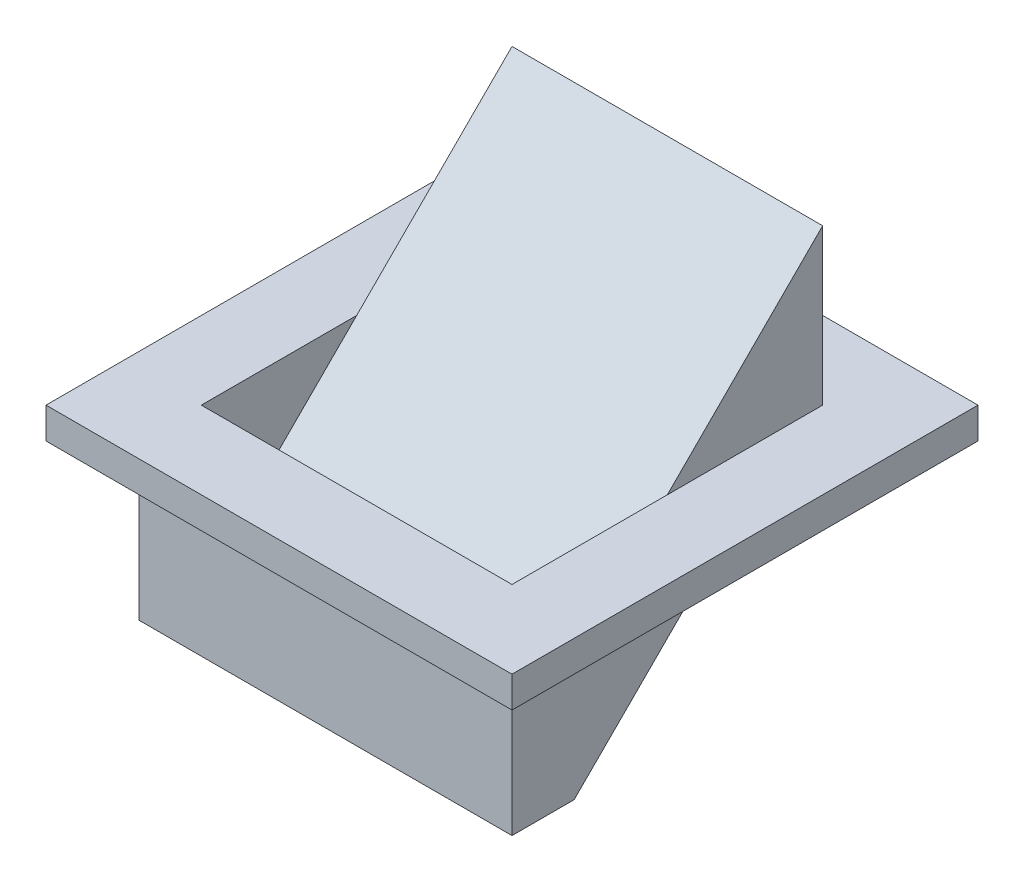
ISO-10303-21;
HEADER;
FILE_DESCRIPTION(('STEP AP214'),'2;1');
FILE_NAME('part.step','',(''),(''),'','','');
FILE_SCHEMA(('AUTOMOTIVE_DESIGN { 1 0 10303 214 1 1 1 1 }'));
ENDSEC;
DATA;
#1=APPLICATION_CONTEXT('core data for automotive mechanical design processes');
#2=APPLICATION_PROTOCOL_DEFINITION('international standard','automotive_design',2000,#1);
#3=PRODUCT_CONTEXT('',#1,'mechanical');
#4=PRODUCT('Part','Part','',(#3));
#5=PRODUCT_RELATED_PRODUCT_CATEGORY('part','',(#4));
#6=PRODUCT_DEFINITION_FORMATION('','',#4);
#7=PRODUCT_DEFINITION_CONTEXT('part definition',#1,'design');
#8=PRODUCT_DEFINITION('design','',#6,#7);
#9=PRODUCT_DEFINITION_SHAPE('','',#8);
#10=(LENGTH_UNIT() NAMED_UNIT(*) SI_UNIT(.MILLI.,.METRE.));
#11=(NAMED_UNIT(*) PLANE_ANGLE_UNIT() SI_UNIT($,.RADIAN.));
#12=(NAMED_UNIT(*) SI_UNIT($,.STERADIAN.) SOLID_ANGLE_UNIT());
#13=UNCERTAINTY_MEASURE_WITH_UNIT(LENGTH_MEASURE(1.E-05),#10,'distance_accuracy_value','');
#14=(GEOMETRIC_REPRESENTATION_CONTEXT(3) GLOBAL_UNCERTAINTY_ASSIGNED_CONTEXT((#13)) GLOBAL_UNIT_ASSIGNED_CONTEXT((#10,
#11,#12)) REPRESENTATION_CONTEXT('',''));
#15=CARTESIAN_POINT('',(0.,0.,0.));
#16=DIRECTION('',(0.,0.,1.));
#17=DIRECTION('',(1.,0.,0.));
#18=AXIS2_PLACEMENT_3D('',#15,#16,#17);
#19=CARTESIAN_POINT('',(0.,60.,-125.));
#20=DIRECTION('',(0.,0.,-1.));
#21=DIRECTION('',(-1.,0.,0.));
#22=AXIS2_PLACEMENT_3D('',#19,#20,#21);
#23=PLANE('',#22);
#24=DIRECTION('',(1.,0.,0.));
#25=VECTOR('',#24,1.);
#26=CARTESIAN_POINT('',(150.,45.8578643762692,-125.));
#27=LINE('',#26,#25);
#28=CARTESIAN_POINT('',(35.,45.8578643762692,-125.));
#29=VERTEX_POINT('',#28);
#30=CARTESIAN_POINT('',(115.,45.8578643762692,-125.));
#31=VERTEX_POINT('',#30);
#32=EDGE_CURVE('E50',#29,#31,#27,.T.);
#33=ORIENTED_EDGE('',*,*,#32,.F.);
#34=DIRECTION('',(0.,-1.,0.));
#35=VECTOR('',#34,1.);
#36=CARTESIAN_POINT('',(35.,60.,-125.));
#37=LINE('',#36,#35);
#38=CARTESIAN_POINT('',(35.,10.,-125.));
#39=VERTEX_POINT('',#38);
#40=EDGE_CURVE('E156',#29,#39,#37,.T.);
#41=ORIENTED_EDGE('',*,*,#40,.T.);
#42=DIRECTION('',(1.,0.,0.));
#43=VECTOR('',#42,1.);
#44=CARTESIAN_POINT('',(0.,10.,-125.));
#45=LINE('',#44,#43);
#46=CARTESIAN_POINT('',(25.,10.,-125.));
#47=VERTEX_POINT('',#46);
#48=EDGE_CURVE('E232',#47,#39,#45,.T.);
#49=ORIENTED_EDGE('',*,*,#48,.F.);
#50=DIRECTION('',(0.,-1.,0.));
#51=VECTOR('',#50,1.);
#52=CARTESIAN_POINT('',(25.,60.,-125.));
#53=LINE('',#52,#51);
#54=CARTESIAN_POINT('',(25.,60.,-125.));
#55=VERTEX_POINT('',#54);
#56=EDGE_CURVE('E231',#55,#47,#53,.T.);
#57=ORIENTED_EDGE('',*,*,#56,.F.);
#58=DIRECTION('',(1.,0.,0.));
#59=VECTOR('',#58,1.);
#60=CARTESIAN_POINT('',(0.,60.,-125.));
#61=LINE('',#60,#59);
#62=CARTESIAN_POINT('',(125.,60.,-125.));
#63=VERTEX_POINT('',#62);
#64=EDGE_CURVE('E228',#55,#63,#61,.T.);
#65=ORIENTED_EDGE('',*,*,#64,.T.);
#66=DIRECTION('',(0.,-1.,0.));
#67=VECTOR('',#66,1.);
#68=CARTESIAN_POINT('',(125.,60.,-125.));
#69=LINE('',#68,#67);
#70=CARTESIAN_POINT('',(125.,10.,-125.));
#71=VERTEX_POINT('',#70);
#72=EDGE_CURVE('E241',#63,#71,#69,.T.);
#73=ORIENTED_EDGE('',*,*,#72,.T.);
#74=CARTESIAN_POINT('',(115.,10.,-125.));
#75=VERTEX_POINT('',#74);
#76=EDGE_CURVE('E238',#75,#71,#45,.T.);
#77=ORIENTED_EDGE('',*,*,#76,.F.);
#78=DIRECTION('',(0.,-1.,0.));
#79=VECTOR('',#78,1.);
#80=CARTESIAN_POINT('',(115.,60.,-125.));
#81=LINE('',#80,#79);
#82=EDGE_CURVE('E162',#31,#75,#81,.T.);
#83=ORIENTED_EDGE('',*,*,#82,.F.);
#84=EDGE_LOOP('',(#33,#41,#49,#57,#65,#73,#77,#83));
#85=FACE_BOUND('',#84,.T.);
#86=ADVANCED_FACE('F35',(#85),#23,.T.);
#87=CARTESIAN_POINT('',(125.,0.,-24.9999999999988));
#88=DIRECTION('',(1.,0.,0.));
#89=DIRECTION('',(0.,0.,-1.));
#90=AXIS2_PLACEMENT_3D('',#87,#88,#89);
#91=PLANE('',#90);
#92=DIRECTION('',(0.,0.707106781186548,-0.707106781186547));
#93=VECTOR('',#92,1.);
#94=CARTESIAN_POINT('',(125.,-32.4999999999994,-32.4999999999994));
#95=LINE('',#94,#93);
#96=CARTESIAN_POINT('',(125.,-40.,-24.9999999999988));
#97=VERTEX_POINT('',#96);
#98=CARTESIAN_POINT('',(125.,10.,-74.9999999999988));
#99=VERTEX_POINT('',#98);
#100=EDGE_CURVE('E183',#97,#99,#95,.T.);
#101=ORIENTED_EDGE('',*,*,#100,.F.);
#102=DIRECTION('',(0.,1.,0.));
#103=VECTOR('',#102,1.);
#104=CARTESIAN_POINT('',(125.,0.,-24.9999999999988));
#105=LINE('',#104,#103);
#106=CARTESIAN_POINT('',(125.,10.,-24.9999999999988));
#107=VERTEX_POINT('',#106);
#108=EDGE_CURVE('E218',#97,#107,#105,.T.);
#109=ORIENTED_EDGE('',*,*,#108,.T.);
#110=DIRECTION('',(0.,0.,-1.));
#111=VECTOR('',#110,1.);
#112=CARTESIAN_POINT('',(125.,10.,-24.9999999999988));
#113=LINE('',#112,#111);
#114=EDGE_CURVE('E214',#107,#99,#113,.T.);
#115=ORIENTED_EDGE('',*,*,#114,.T.);
#116=EDGE_LOOP('',(#101,#109,#115));
#117=FACE_BOUND('',#116,.T.);
#118=ADVANCED_FACE('F317',(#117),#91,.F.);
#119=CARTESIAN_POINT('',(25.,0.,-74.9999999999988));
#120=DIRECTION('',(-1.,0.,0.));
#121=DIRECTION('',(0.,0.,1.));
#122=AXIS2_PLACEMENT_3D('',#119,#120,#121);
#123=PLANE('',#122);
#124=DIRECTION('',(0.,1.,0.));
#125=VECTOR('',#124,1.);
#126=CARTESIAN_POINT('',(25.,0.,-24.9999999999988));
#127=LINE('',#126,#125);
#128=CARTESIAN_POINT('',(25.,-40.,-24.9999999999988));
#129=VERTEX_POINT('',#128);
#130=CARTESIAN_POINT('',(25.,10.,-24.9999999999988));
#131=VERTEX_POINT('',#130);
#132=EDGE_CURVE('E217',#129,#131,#127,.T.);
#133=ORIENTED_EDGE('',*,*,#132,.F.);
#134=DIRECTION('',(0.,0.707106781186548,-0.707106781186547));
#135=VECTOR('',#134,1.);
#136=CARTESIAN_POINT('',(25.,-32.4999999999994,-32.4999999999994));
#137=LINE('',#136,#135);
#138=CARTESIAN_POINT('',(25.,10.,-74.9999999999988));
#139=VERTEX_POINT('',#138);
#140=EDGE_CURVE('E182',#129,#139,#137,.T.);
#141=ORIENTED_EDGE('',*,*,#140,.T.);
#142=DIRECTION('',(0.,0.,1.));
#143=VECTOR('',#142,1.);
#144=CARTESIAN_POINT('',(25.,10.,-74.9999999999988));
#145=LINE('',#144,#143);
#146=EDGE_CURVE('E208',#139,#131,#145,.T.);
#147=ORIENTED_EDGE('',*,*,#146,.T.);
#148=EDGE_LOOP('',(#133,#141,#147));
#149=FACE_BOUND('',#148,.T.);
#150=ADVANCED_FACE('F311',(#149),#123,.F.);
#151=CARTESIAN_POINT('',(0.,0.,0.));
#152=DIRECTION('',(0.,-1.,0.));
#153=DIRECTION('',(0.,0.,-1.));
#154=AXIS2_PLACEMENT_3D('',#151,#152,#153);
#155=PLANE('',#154);
#156=DIRECTION('',(1.,0.,0.));
#157=VECTOR('',#156,1.);
#158=CARTESIAN_POINT('',(135.,0.,-84.9999999999988));
#159=LINE('',#158,#157);
#160=CARTESIAN_POINT('',(15.,0.,-84.9999999999988));
#161=VERTEX_POINT('',#160);
#162=CARTESIAN_POINT('',(135.,0.,-84.9999999999988));
#163=VERTEX_POINT('',#162);
#164=EDGE_CURVE('E190',#161,#163,#159,.T.);
#165=ORIENTED_EDGE('',*,*,#164,.F.);
#166=DIRECTION('',(0.,0.,-1.));
#167=VECTOR('',#166,1.);
#168=CARTESIAN_POINT('',(15.,0.,-84.9999999999988));
#169=LINE('',#168,#167);
#170=CARTESIAN_POINT('',(15.,0.,-14.9999999999988));
#171=VERTEX_POINT('',#170);
#172=EDGE_CURVE('E200',#171,#161,#169,.T.);
#173=ORIENTED_EDGE('',*,*,#172,.F.);
#174=DIRECTION('',(-1.,0.,0.));
#175=VECTOR('',#174,1.);
#176=CARTESIAN_POINT('',(135.,0.,-14.9999999999988));
#177=LINE('',#176,#175);
#178=CARTESIAN_POINT('',(135.,0.,-14.9999999999988));
#179=VERTEX_POINT('',#178);
#180=EDGE_CURVE('E198',#179,#171,#177,.T.);
#181=ORIENTED_EDGE('',*,*,#180,.F.);
#182=DIRECTION('',(0.,0.,1.));
#183=VECTOR('',#182,1.);
#184=CARTESIAN_POINT('',(135.,0.,-84.9999999999988));
#185=LINE('',#184,#183);
#186=EDGE_CURVE('E185',#163,#179,#185,.T.);
#187=ORIENTED_EDGE('',*,*,#186,.F.);
#188=EDGE_LOOP('',(#165,#173,#181,#187));
#189=FACE_BOUND('',#188,.T.);
#190=DIRECTION('',(0.,0.,1.));
#191=VECTOR('',#190,1.);
#192=CARTESIAN_POINT('',(0.,0.,0.));
#193=LINE('',#192,#191);
#194=CARTESIAN_POINT('',(0.,0.,-150.));
#195=VERTEX_POINT('',#194);
#196=CARTESIAN_POINT('',(0.,0.,0.));
#197=VERTEX_POINT('',#196);
#198=EDGE_CURVE('E244',#195,#197,#193,.T.);
#199=ORIENTED_EDGE('',*,*,#198,.F.);
#200=DIRECTION('',(-1.,0.,0.));
#201=VECTOR('',#200,1.);
#202=CARTESIAN_POINT('',(0.,0.,-150.));
#203=LINE('',#202,#201);
#204=CARTESIAN_POINT('',(150.,0.,-150.));
#205=VERTEX_POINT('',#204);
#206=EDGE_CURVE('E249',#205,#195,#203,.T.);
#207=ORIENTED_EDGE('',*,*,#206,.F.);
#208=DIRECTION('',(0.,0.,-1.));
#209=VECTOR('',#208,1.);
#210=CARTESIAN_POINT('',(150.,0.,0.));
#211=LINE('',#210,#209);
#212=CARTESIAN_POINT('',(150.,0.,0.));
#213=VERTEX_POINT('',#212);
#214=EDGE_CURVE('E259',#213,#205,#211,.T.);
#215=ORIENTED_EDGE('',*,*,#214,.F.);
#216=DIRECTION('',(1.,0.,0.));
#217=VECTOR('',#216,1.);
#218=CARTESIAN_POINT('',(0.,0.,0.));
#219=LINE('',#218,#217);
#220=EDGE_CURVE('E257',#197,#213,#219,.T.);
#221=ORIENTED_EDGE('',*,*,#220,.F.);
#222=EDGE_LOOP('',(#199,#207,#215,#221));
#223=FACE_BOUND('',#222,.T.);
#224=ADVANCED_FACE('F282',(#189,#223),#155,.T.);
#225=CARTESIAN_POINT('',(0.,10.,0.));
#226=DIRECTION('',(1.,0.,0.));
#227=DIRECTION('',(0.,0.,-1.));
#228=AXIS2_PLACEMENT_3D('',#225,#226,#227);
#229=PLANE('',#228);
#230=ORIENTED_EDGE('',*,*,#198,.T.);
#231=DIRECTION('',(0.,-1.,0.));
#232=VECTOR('',#231,1.);
#233=CARTESIAN_POINT('',(0.,10.,0.));
#234=LINE('',#233,#232);
#235=CARTESIAN_POINT('',(0.,10.,0.));
#236=VERTEX_POINT('',#235);
#237=EDGE_CURVE('E43',#236,#197,#234,.T.);
#238=ORIENTED_EDGE('',*,*,#237,.F.);
#239=DIRECTION('',(0.,0.,1.));
#240=VECTOR('',#239,1.);
#241=CARTESIAN_POINT('',(0.,10.,0.));
#242=LINE('',#241,#240);
#243=CARTESIAN_POINT('',(0.,10.,-150.));
#244=VERTEX_POINT('',#243);
#245=EDGE_CURVE('E245',#244,#236,#242,.T.);
#246=ORIENTED_EDGE('',*,*,#245,.F.);
#247=DIRECTION('',(0.,-1.,0.));
#248=VECTOR('',#247,1.);
#249=CARTESIAN_POINT('',(0.,10.,-150.));
#250=LINE('',#249,#248);
#251=EDGE_CURVE('E255',#244,#195,#250,.T.);
#252=ORIENTED_EDGE('',*,*,#251,.T.);
#253=EDGE_LOOP('',(#230,#238,#246,#252));
#254=FACE_BOUND('',#253,.T.);
#255=ADVANCED_FACE('F37',(#254),#229,.F.);
#256=CARTESIAN_POINT('',(0.,10.,0.));
#257=DIRECTION('',(0.,0.,-1.));
#258=DIRECTION('',(-1.,0.,0.));
#259=AXIS2_PLACEMENT_3D('',#256,#257,#258);
#260=PLANE('',#259);
#261=ORIENTED_EDGE('',*,*,#220,.T.);
#262=DIRECTION('',(0.,-1.,0.));
#263=VECTOR('',#262,1.);
#264=CARTESIAN_POINT('',(150.,10.,0.));
#265=LINE('',#264,#263);
#266=CARTESIAN_POINT('',(150.,10.,0.));
#267=VERTEX_POINT('',#266);
#268=EDGE_CURVE('E267',#267,#213,#265,.T.);
#269=ORIENTED_EDGE('',*,*,#268,.F.);
#270=DIRECTION('',(1.,0.,0.));
#271=VECTOR('',#270,1.);
#272=CARTESIAN_POINT('',(0.,10.,0.));
#273=LINE('',#272,#271);
#274=EDGE_CURVE('E248',#236,#267,#273,.T.);
#275=ORIENTED_EDGE('',*,*,#274,.F.);
#276=ORIENTED_EDGE('',*,*,#237,.T.);
#277=EDGE_LOOP('',(#261,#269,#275,#276));
#278=FACE_BOUND('',#277,.T.);
#279=ADVANCED_FACE('F272',(#278),#260,.F.);
#280=CARTESIAN_POINT('',(150.,10.,0.));
#281=DIRECTION('',(-1.,0.,0.));
#282=DIRECTION('',(0.,0.,1.));
#283=AXIS2_PLACEMENT_3D('',#280,#281,#282);
#284=PLANE('',#283);
#285=ORIENTED_EDGE('',*,*,#214,.T.);
#286=DIRECTION('',(0.,-1.,0.));
#287=VECTOR('',#286,1.);
#288=CARTESIAN_POINT('',(150.,10.,-150.));
#289=LINE('',#288,#287);
#290=CARTESIAN_POINT('',(150.,10.,-150.));
#291=VERTEX_POINT('',#290);
#292=EDGE_CURVE('E264',#291,#205,#289,.T.);
#293=ORIENTED_EDGE('',*,*,#292,.F.);
#294=DIRECTION('',(0.,0.,-1.));
#295=VECTOR('',#294,1.);
#296=CARTESIAN_POINT('',(150.,10.,0.));
#297=LINE('',#296,#295);
#298=EDGE_CURVE('E251',#267,#291,#297,.T.);
#299=ORIENTED_EDGE('',*,*,#298,.F.);
#300=ORIENTED_EDGE('',*,*,#268,.T.);
#301=EDGE_LOOP('',(#285,#293,#299,#300));
#302=FACE_BOUND('',#301,.T.);
#303=ADVANCED_FACE('F285',(#302),#284,.F.);
#304=CARTESIAN_POINT('',(0.,10.,-150.));
#305=DIRECTION('',(0.,0.,1.));
#306=DIRECTION('',(1.,0.,0.));
#307=AXIS2_PLACEMENT_3D('',#304,#305,#306);
#308=PLANE('',#307);
#309=ORIENTED_EDGE('',*,*,#206,.T.);
#310=ORIENTED_EDGE('',*,*,#251,.F.);
#311=DIRECTION('',(-1.,0.,0.));
#312=VECTOR('',#311,1.);
#313=CARTESIAN_POINT('',(0.,10.,-150.));
#314=LINE('',#313,#312);
#315=EDGE_CURVE('E253',#291,#244,#314,.T.);
#316=ORIENTED_EDGE('',*,*,#315,.F.);
#317=ORIENTED_EDGE('',*,*,#292,.T.);
#318=EDGE_LOOP('',(#309,#310,#316,#317));
#319=FACE_BOUND('',#318,.T.);
#320=ADVANCED_FACE('F289',(#319),#308,.F.);
#321=CARTESIAN_POINT('',(0.,10.,0.));
#322=DIRECTION('',(0.,-1.,0.));
#323=DIRECTION('',(0.,0.,-1.));
#324=AXIS2_PLACEMENT_3D('',#321,#322,#323);
#325=PLANE('',#324);
#326=ORIENTED_EDGE('',*,*,#298,.T.);
#327=ORIENTED_EDGE('',*,*,#315,.T.);
#328=ORIENTED_EDGE('',*,*,#245,.T.);
#329=ORIENTED_EDGE('',*,*,#274,.T.);
#330=EDGE_LOOP('',(#326,#327,#328,#329));
#331=FACE_BOUND('',#330,.T.);
#332=DIRECTION('',(0.,0.,-1.));
#333=VECTOR('',#332,1.);
#334=CARTESIAN_POINT('',(125.,10.,0.));
#335=LINE('',#334,#333);
#336=EDGE_CURVE('E235',#99,#71,#335,.T.);
#337=ORIENTED_EDGE('',*,*,#336,.F.);
#338=ORIENTED_EDGE('',*,*,#114,.F.);
#339=DIRECTION('',(1.,0.,0.));
#340=VECTOR('',#339,1.);
#341=CARTESIAN_POINT('',(25.,10.,-24.9999999999988));
#342=LINE('',#341,#340);
#343=EDGE_CURVE('E211',#131,#107,#342,.T.);
#344=ORIENTED_EDGE('',*,*,#343,.F.);
#345=ORIENTED_EDGE('',*,*,#146,.F.);
#346=DIRECTION('',(0.,0.,-1.));
#347=VECTOR('',#346,1.);
#348=CARTESIAN_POINT('',(25.,10.,0.));
#349=LINE('',#348,#347);
#350=EDGE_CURVE('E227',#139,#47,#349,.T.);
#351=ORIENTED_EDGE('',*,*,#350,.T.);
#352=ORIENTED_EDGE('',*,*,#48,.T.);
#353=DIRECTION('',(0.,0.,-1.));
#354=VECTOR('',#353,1.);
#355=CARTESIAN_POINT('',(35.,10.,0.));
#356=LINE('',#355,#354);
#357=CARTESIAN_POINT('',(35.,10.,-89.1421356237299));
#358=VERTEX_POINT('',#357);
#359=EDGE_CURVE('E158',#358,#39,#356,.T.);
#360=ORIENTED_EDGE('',*,*,#359,.F.);
#361=DIRECTION('',(1.,0.,0.));
#362=VECTOR('',#361,1.);
#363=CARTESIAN_POINT('',(0.,10.,-89.1421356237299));
#364=LINE('',#363,#362);
#365=CARTESIAN_POINT('',(115.,10.,-89.1421356237299));
#366=VERTEX_POINT('',#365);
#367=EDGE_CURVE('E150',#358,#366,#364,.T.);
#368=ORIENTED_EDGE('',*,*,#367,.T.);
#369=DIRECTION('',(0.,0.,-1.));
#370=VECTOR('',#369,1.);
#371=CARTESIAN_POINT('',(115.,10.,0.));
#372=LINE('',#371,#370);
#373=EDGE_CURVE('E171',#366,#75,#372,.T.);
#374=ORIENTED_EDGE('',*,*,#373,.T.);
#375=ORIENTED_EDGE('',*,*,#76,.T.);
#376=EDGE_LOOP('',(#337,#338,#344,#345,#351,#352,#360,#368,#374,#375));
#377=FACE_BOUND('',#376,.T.);
#378=ADVANCED_FACE('F291',(#331,#377),#325,.F.);
#379=CARTESIAN_POINT('',(25.,60.,0.));
#380=DIRECTION('',(-1.,0.,0.));
#381=DIRECTION('',(0.,0.,1.));
#382=AXIS2_PLACEMENT_3D('',#379,#380,#381);
#383=PLANE('',#382);
#384=DIRECTION('',(0.,-0.707106781186539,0.707106781186556));
#385=VECTOR('',#384,1.);
#386=CARTESIAN_POINT('',(25.,60.,-125.));
#387=LINE('',#386,#385);
#388=EDGE_CURVE('E220',#55,#139,#387,.T.);
#389=ORIENTED_EDGE('',*,*,#388,.F.);
#390=ORIENTED_EDGE('',*,*,#56,.T.);
#391=ORIENTED_EDGE('',*,*,#350,.F.);
#392=EDGE_LOOP('',(#389,#390,#391));
#393=FACE_BOUND('',#392,.T.);
#394=ADVANCED_FACE('F294',(#393),#383,.T.);
#395=CARTESIAN_POINT('',(125.,60.,0.));
#396=DIRECTION('',(-1.,0.,0.));
#397=DIRECTION('',(0.,0.,1.));
#398=AXIS2_PLACEMENT_3D('',#395,#396,#397);
#399=PLANE('',#398);
#400=ORIENTED_EDGE('',*,*,#72,.F.);
#401=DIRECTION('',(0.,-0.707106781186539,0.707106781186556));
#402=VECTOR('',#401,1.);
#403=CARTESIAN_POINT('',(125.,-2.50000000000001,-62.4999999999985));
#404=LINE('',#403,#402);
#405=EDGE_CURVE('E224',#63,#99,#404,.T.);
#406=ORIENTED_EDGE('',*,*,#405,.T.);
#407=ORIENTED_EDGE('',*,*,#336,.T.);
#408=EDGE_LOOP('',(#400,#406,#407));
#409=FACE_BOUND('',#408,.T.);
#410=ADVANCED_FACE('F301',(#409),#399,.F.);
#411=CARTESIAN_POINT('',(150.,60.,-125.));
#412=DIRECTION('',(0.,-0.707106781186556,-0.707106781186539));
#413=DIRECTION('',(0.,0.707106781186539,-0.707106781186556));
#414=AXIS2_PLACEMENT_3D('',#411,#412,#413);
#415=PLANE('',#414);
#416=ORIENTED_EDGE('',*,*,#64,.F.);
#417=ORIENTED_EDGE('',*,*,#388,.T.);
#418=ORIENTED_EDGE('',*,*,#140,.F.);
#419=DIRECTION('',(1.,0.,0.));
#420=VECTOR('',#419,1.);
#421=CARTESIAN_POINT('',(25.,-40.,-24.9999999999988));
#422=LINE('',#421,#420);
#423=EDGE_CURVE('E179',#129,#97,#422,.T.);
#424=ORIENTED_EDGE('',*,*,#423,.T.);
#425=ORIENTED_EDGE('',*,*,#100,.T.);
#426=ORIENTED_EDGE('',*,*,#405,.F.);
#427=EDGE_LOOP('',(#416,#417,#418,#424,#425,#426));
#428=FACE_BOUND('',#427,.T.);
#429=ADVANCED_FACE('F305',(#428),#415,.F.);
#430=CARTESIAN_POINT('',(25.,0.,-24.9999999999988));
#431=DIRECTION('',(0.,0.,1.));
#432=DIRECTION('',(1.,0.,0.));
#433=AXIS2_PLACEMENT_3D('',#430,#431,#432);
#434=PLANE('',#433);
#435=ORIENTED_EDGE('',*,*,#343,.T.);
#436=ORIENTED_EDGE('',*,*,#108,.F.);
#437=ORIENTED_EDGE('',*,*,#423,.F.);
#438=ORIENTED_EDGE('',*,*,#132,.T.);
#439=EDGE_LOOP('',(#435,#436,#437,#438));
#440=FACE_BOUND('',#439,.T.);
#441=ADVANCED_FACE('F315',(#440),#434,.F.);
#442=CARTESIAN_POINT('',(135.,-50.,-84.9999999999988));
#443=DIRECTION('',(-1.,0.,0.));
#444=DIRECTION('',(0.,0.,1.));
#445=AXIS2_PLACEMENT_3D('',#442,#443,#444);
#446=PLANE('',#445);
#447=DIRECTION('',(0.,0.,1.));
#448=VECTOR('',#447,1.);
#449=CARTESIAN_POINT('',(135.,-50.,-84.9999999999988));
#450=LINE('',#449,#448);
#451=CARTESIAN_POINT('',(135.,-50.,-34.9999999999988));
#452=VERTEX_POINT('',#451);
#453=CARTESIAN_POINT('',(135.,-50.,-14.9999999999988));
#454=VERTEX_POINT('',#453);
#455=EDGE_CURVE('E187',#452,#454,#450,.T.);
#456=ORIENTED_EDGE('',*,*,#455,.F.);
#457=DIRECTION('',(0.,-0.707106781186547,0.707106781186547));
#458=VECTOR('',#457,1.);
#459=CARTESIAN_POINT('',(135.,-50.,-34.9999999999988));
#460=LINE('',#459,#458);
#461=EDGE_CURVE('E57',#163,#452,#460,.T.);
#462=ORIENTED_EDGE('',*,*,#461,.F.);
#463=ORIENTED_EDGE('',*,*,#186,.T.);
#464=DIRECTION('',(0.,1.,0.));
#465=VECTOR('',#464,1.);
#466=CARTESIAN_POINT('',(135.,-50.,-14.9999999999988));
#467=LINE('',#466,#465);
#468=EDGE_CURVE('E206',#454,#179,#467,.T.);
#469=ORIENTED_EDGE('',*,*,#468,.F.);
#470=EDGE_LOOP('',(#456,#462,#463,#469));
#471=FACE_BOUND('',#470,.T.);
#472=ADVANCED_FACE('F328',(#471),#446,.F.);
#473=CARTESIAN_POINT('',(135.,-50.,-14.9999999999988));
#474=DIRECTION('',(0.,0.,-1.));
#475=DIRECTION('',(-1.,0.,0.));
#476=AXIS2_PLACEMENT_3D('',#473,#474,#475);
#477=PLANE('',#476);
#478=ORIENTED_EDGE('',*,*,#180,.T.);
#479=DIRECTION('',(0.,1.,0.));
#480=VECTOR('',#479,1.);
#481=CARTESIAN_POINT('',(15.,-50.,-14.9999999999988));
#482=LINE('',#481,#480);
#483=CARTESIAN_POINT('',(15.,-50.,-14.9999999999988));
#484=VERTEX_POINT('',#483);
#485=EDGE_CURVE('E195',#484,#171,#482,.T.);
#486=ORIENTED_EDGE('',*,*,#485,.F.);
#487=DIRECTION('',(-1.,0.,0.));
#488=VECTOR('',#487,1.);
#489=CARTESIAN_POINT('',(135.,-50.,-14.9999999999988));
#490=LINE('',#489,#488);
#491=EDGE_CURVE('E189',#454,#484,#490,.T.);
#492=ORIENTED_EDGE('',*,*,#491,.F.);
#493=ORIENTED_EDGE('',*,*,#468,.T.);
#494=EDGE_LOOP('',(#478,#486,#492,#493));
#495=FACE_BOUND('',#494,.T.);
#496=ADVANCED_FACE('F386',(#495),#477,.F.);
#497=CARTESIAN_POINT('',(15.,-50.,-84.9999999999988));
#498=DIRECTION('',(1.,0.,0.));
#499=DIRECTION('',(0.,0.,-1.));
#500=AXIS2_PLACEMENT_3D('',#497,#498,#499);
#501=PLANE('',#500);
#502=ORIENTED_EDGE('',*,*,#172,.T.);
#503=DIRECTION('',(0.,-0.707106781186548,0.707106781186548));
#504=VECTOR('',#503,1.);
#505=CARTESIAN_POINT('',(15.,-25.,-59.9999999999988));
#506=LINE('',#505,#504);
#507=CARTESIAN_POINT('',(15.,-50.,-34.9999999999988));
#508=VERTEX_POINT('',#507);
#509=EDGE_CURVE('E176',#161,#508,#506,.T.);
#510=ORIENTED_EDGE('',*,*,#509,.T.);
#511=DIRECTION('',(0.,0.,-1.));
#512=VECTOR('',#511,1.);
#513=CARTESIAN_POINT('',(15.,-50.,-84.9999999999988));
#514=LINE('',#513,#512);
#515=EDGE_CURVE('E192',#484,#508,#514,.T.);
#516=ORIENTED_EDGE('',*,*,#515,.F.);
#517=ORIENTED_EDGE('',*,*,#485,.T.);
#518=EDGE_LOOP('',(#502,#510,#516,#517));
#519=FACE_BOUND('',#518,.T.);
#520=ADVANCED_FACE('F394',(#519),#501,.F.);
#521=CARTESIAN_POINT('',(0.,-50.,0.));
#522=DIRECTION('',(0.,-1.,0.));
#523=DIRECTION('',(0.,0.,-1.));
#524=AXIS2_PLACEMENT_3D('',#521,#522,#523);
#525=PLANE('',#524);
#526=DIRECTION('',(-1.,0.,0.));
#527=VECTOR('',#526,1.);
#528=CARTESIAN_POINT('',(0.,-50.,-34.9999999999988));
#529=LINE('',#528,#527);
#530=EDGE_CURVE('E11',#452,#508,#529,.T.);
#531=ORIENTED_EDGE('',*,*,#530,.F.);
#532=ORIENTED_EDGE('',*,*,#455,.T.);
#533=ORIENTED_EDGE('',*,*,#491,.T.);
#534=ORIENTED_EDGE('',*,*,#515,.T.);
#535=EDGE_LOOP('',(#531,#532,#533,#534));
#536=FACE_BOUND('',#535,.T.);
#537=ADVANCED_FACE('F402',(#536),#525,.T.);
#538=CARTESIAN_POINT('',(0.,-50.,-34.9999999999988));
#539=DIRECTION('',(0.,0.707106781186548,0.707106781186548));
#540=DIRECTION('',(0.,-0.707106781186548,0.707106781186548));
#541=AXIS2_PLACEMENT_3D('',#538,#539,#540);
#542=PLANE('',#541);
#543=ORIENTED_EDGE('',*,*,#164,.T.);
#544=ORIENTED_EDGE('',*,*,#461,.T.);
#545=ORIENTED_EDGE('',*,*,#530,.T.);
#546=ORIENTED_EDGE('',*,*,#509,.F.);
#547=EDGE_LOOP('',(#543,#544,#545,#546));
#548=FACE_BOUND('',#547,.T.);
#549=ADVANCED_FACE('F410',(#548),#542,.F.);
#550=CARTESIAN_POINT('',(35.,60.,0.));
#551=DIRECTION('',(-1.,0.,0.));
#552=DIRECTION('',(0.,0.,1.));
#553=AXIS2_PLACEMENT_3D('',#550,#551,#552);
#554=PLANE('',#553);
#555=ORIENTED_EDGE('',*,*,#359,.T.);
#556=ORIENTED_EDGE('',*,*,#40,.F.);
#557=DIRECTION('',(0.,-0.707106781186539,0.707106781186556));
#558=VECTOR('',#557,1.);
#559=CARTESIAN_POINT('',(35.,-9.57106781186556,-69.5710678118639));
#560=LINE('',#559,#558);
#561=EDGE_CURVE('E146',#29,#358,#560,.T.);
#562=ORIENTED_EDGE('',*,*,#561,.T.);
#563=EDGE_LOOP('',(#555,#556,#562));
#564=FACE_BOUND('',#563,.T.);
#565=ADVANCED_FACE('F157',(#564),#554,.F.);
#566=CARTESIAN_POINT('',(150.,52.9289321881344,-132.071067811865));
#567=DIRECTION('',(0.,-0.707106781186556,-0.707106781186539));
#568=DIRECTION('',(0.,0.707106781186539,-0.707106781186556));
#569=AXIS2_PLACEMENT_3D('',#566,#567,#568);
#570=PLANE('',#569);
#571=ORIENTED_EDGE('',*,*,#561,.F.);
#572=ORIENTED_EDGE('',*,*,#32,.T.);
#573=DIRECTION('',(0.,-0.707106781186539,0.707106781186556));
#574=VECTOR('',#573,1.);
#575=CARTESIAN_POINT('',(115.,-9.57106781186556,-69.5710678118639));
#576=LINE('',#575,#574);
#577=EDGE_CURVE('E153',#31,#366,#576,.T.);
#578=ORIENTED_EDGE('',*,*,#577,.T.);
#579=ORIENTED_EDGE('',*,*,#367,.F.);
#580=EDGE_LOOP('',(#571,#572,#578,#579));
#581=FACE_BOUND('',#580,.T.);
#582=ADVANCED_FACE('F148',(#581),#570,.T.);
#583=CARTESIAN_POINT('',(115.,60.,0.));
#584=DIRECTION('',(-1.,0.,0.));
#585=DIRECTION('',(0.,0.,1.));
#586=AXIS2_PLACEMENT_3D('',#583,#584,#585);
#587=PLANE('',#586);
#588=ORIENTED_EDGE('',*,*,#577,.F.);
#589=ORIENTED_EDGE('',*,*,#82,.T.);
#590=ORIENTED_EDGE('',*,*,#373,.F.);
#591=EDGE_LOOP('',(#588,#589,#590));
#592=FACE_BOUND('',#591,.T.);
#593=ADVANCED_FACE('F437',(#592),#587,.T.);
#594=CLOSED_SHELL('',(#86,#118,#150,#224,#255,#279,#303,#320,#378,#394,#410,#429,#441,#472,#496,
#520,#537,#549,#565,#582,#593));
#595=MANIFOLD_SOLID_BREP('B2',#594);
#596=ADVANCED_BREP_SHAPE_REPRESENTATION('',(#18,#595),#14);
#597=SHAPE_DEFINITION_REPRESENTATION(#9,#596);
ENDSEC;
END-ISO-10303-21;
